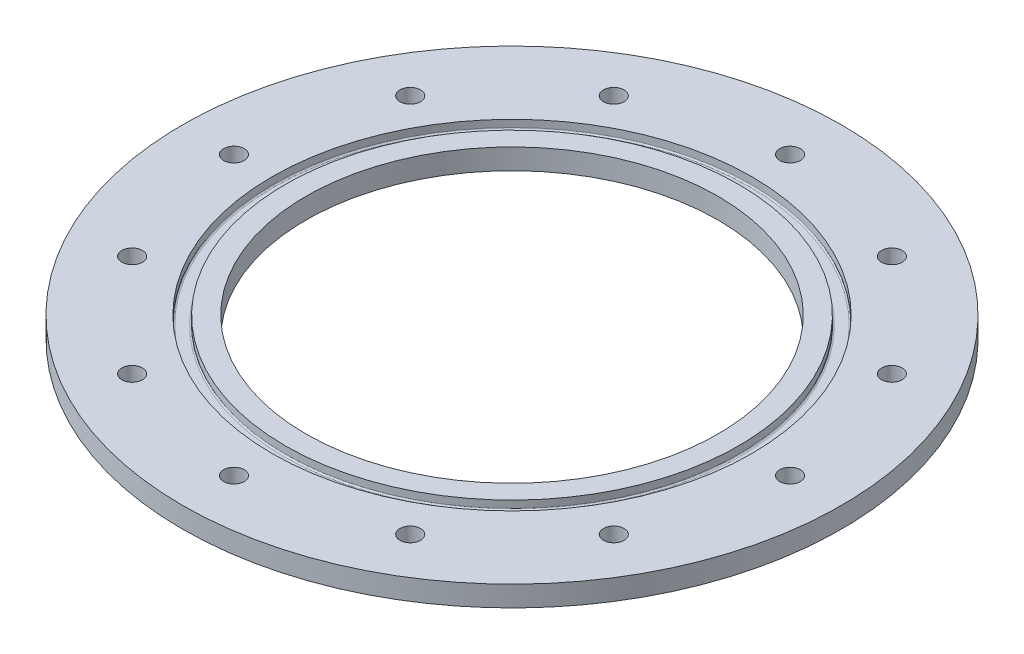
ISO-10303-21;
HEADER;
FILE_DESCRIPTION(('STEP AP214'),'2;1');
FILE_NAME('part.step','',(''),(''),'','','');
FILE_SCHEMA(('AUTOMOTIVE_DESIGN { 1 0 10303 214 1 1 1 1 }'));
ENDSEC;
DATA;
#1=APPLICATION_CONTEXT('core data for automotive mechanical design processes');
#2=APPLICATION_PROTOCOL_DEFINITION('international standard','automotive_design',2000,#1);
#3=PRODUCT_CONTEXT('',#1,'mechanical');
#4=PRODUCT('Part','Part','',(#3));
#5=PRODUCT_RELATED_PRODUCT_CATEGORY('part','',(#4));
#6=PRODUCT_DEFINITION_FORMATION('','',#4);
#7=PRODUCT_DEFINITION_CONTEXT('part definition',#1,'design');
#8=PRODUCT_DEFINITION('design','',#6,#7);
#9=PRODUCT_DEFINITION_SHAPE('','',#8);
#10=(LENGTH_UNIT() NAMED_UNIT(*) SI_UNIT(.MILLI.,.METRE.));
#11=(NAMED_UNIT(*) PLANE_ANGLE_UNIT() SI_UNIT($,.RADIAN.));
#12=(NAMED_UNIT(*) SI_UNIT($,.STERADIAN.) SOLID_ANGLE_UNIT());
#13=UNCERTAINTY_MEASURE_WITH_UNIT(LENGTH_MEASURE(1.E-05),#10,'distance_accuracy_value','');
#14=(GEOMETRIC_REPRESENTATION_CONTEXT(3) GLOBAL_UNCERTAINTY_ASSIGNED_CONTEXT((#13)) GLOBAL_UNIT_ASSIGNED_CONTEXT((#10,
#11,#12)) REPRESENTATION_CONTEXT('',''));
#15=CARTESIAN_POINT('',(0.,0.,0.));
#16=DIRECTION('',(0.,0.,1.));
#17=DIRECTION('',(1.,0.,0.));
#18=AXIS2_PLACEMENT_3D('',#15,#16,#17);
#19=CARTESIAN_POINT('',(0.,6.35000000000002,0.));
#20=DIRECTION('',(0.,1.,0.));
#21=DIRECTION('',(0.,0.,1.));
#22=AXIS2_PLACEMENT_3D('',#19,#20,#21);
#23=PLANE('',#22);
#24=CARTESIAN_POINT('',(0.,6.35000000000002,0.));
#25=DIRECTION('',(0.,1.,0.));
#26=DIRECTION('',(0.,0.,1.));
#27=AXIS2_PLACEMENT_3D('',#24,#25,#26);
#28=CIRCLE('',#27,63.5);
#29=CARTESIAN_POINT('',(0.,6.35000000000002,63.5));
#30=VERTEX_POINT('',#29);
#31=EDGE_CURVE('E84',#30,#30,#28,.T.);
#32=ORIENTED_EDGE('',*,*,#31,.F.);
#33=EDGE_LOOP('',(#32));
#34=FACE_BOUND('',#33,.T.);
#35=CARTESIAN_POINT('',(0.,6.35000000000002,0.));
#36=DIRECTION('',(0.,1.,0.));
#37=DIRECTION('',(0.,0.,1.));
#38=AXIS2_PLACEMENT_3D('',#35,#36,#37);
#39=CIRCLE('',#38,69.85);
#40=CARTESIAN_POINT('',(0.,6.35000000000002,69.85));
#41=VERTEX_POINT('',#40);
#42=EDGE_CURVE('E191',#41,#41,#39,.T.);
#43=ORIENTED_EDGE('',*,*,#42,.T.);
#44=EDGE_LOOP('',(#43));
#45=FACE_BOUND('',#44,.T.);
#46=ADVANCED_FACE('F51',(#34,#45),#23,.T.);
#47=CARTESIAN_POINT('',(0.,6.35000000000002,0.));
#48=DIRECTION('',(0.,-1.,0.));
#49=DIRECTION('',(0.,0.,-1.));
#50=AXIS2_PLACEMENT_3D('',#47,#48,#49);
#51=CYLINDRICAL_SURFACE('',#50,101.6);
#52=CARTESIAN_POINT('',(0.,6.35000000000002,0.));
#53=DIRECTION('',(0.,1.,0.));
#54=DIRECTION('',(0.,0.,1.));
#55=AXIS2_PLACEMENT_3D('',#52,#53,#54);
#56=CIRCLE('',#55,101.6);
#57=CARTESIAN_POINT('',(0.,6.35000000000002,101.6));
#58=VERTEX_POINT('',#57);
#59=EDGE_CURVE('E75',#58,#58,#56,.T.);
#60=ORIENTED_EDGE('',*,*,#59,.F.);
#61=EDGE_LOOP('',(#60));
#62=FACE_BOUND('',#61,.T.);
#63=CARTESIAN_POINT('',(0.,0.,0.));
#64=DIRECTION('',(0.,1.,0.));
#65=DIRECTION('',(0.,0.,1.));
#66=AXIS2_PLACEMENT_3D('',#63,#64,#65);
#67=CIRCLE('',#66,101.6);
#68=CARTESIAN_POINT('',(0.,0.,101.6));
#69=VERTEX_POINT('',#68);
#70=EDGE_CURVE('E76',#69,#69,#67,.T.);
#71=ORIENTED_EDGE('',*,*,#70,.T.);
#72=EDGE_LOOP('',(#71));
#73=FACE_BOUND('',#72,.T.);
#74=ADVANCED_FACE('F211',(#62,#73),#51,.T.);
#75=CARTESIAN_POINT('',(0.,6.35000000000002,0.));
#76=DIRECTION('',(0.,1.,0.));
#77=DIRECTION('',(0.,0.,1.));
#78=AXIS2_PLACEMENT_3D('',#75,#76,#77);
#79=CIRCLE('',#78,73.9394);
#80=CARTESIAN_POINT('',(0.,6.35000000000002,73.9394));
#81=VERTEX_POINT('',#80);
#82=EDGE_CURVE('E173',#81,#81,#79,.T.);
#83=ORIENTED_EDGE('',*,*,#82,.F.);
#84=EDGE_LOOP('',(#83));
#85=FACE_BOUND('',#84,.T.);
#86=CARTESIAN_POINT('',(-42.8624999999995,6.35000000000002,-74.2400277394192));
#87=DIRECTION('',(0.,1.,0.));
#88=DIRECTION('',(0.,0.,1.));
#89=AXIS2_PLACEMENT_3D('',#86,#87,#88);
#90=CIRCLE('',#89,3.1750000000021);
#91=CARTESIAN_POINT('',(-42.8624999999995,6.35000000000002,-71.0650277394171));
#92=VERTEX_POINT('',#91);
#93=EDGE_CURVE('E99',#92,#92,#90,.T.);
#94=ORIENTED_EDGE('',*,*,#93,.F.);
#95=EDGE_LOOP('',(#94));
#96=FACE_BOUND('',#95,.T.);
#97=CARTESIAN_POINT('',(42.8625,6.35000000000002,-74.240027739421));
#98=DIRECTION('',(0.,1.,0.));
#99=DIRECTION('',(0.,0.,1.));
#100=AXIS2_PLACEMENT_3D('',#97,#98,#99);
#101=CIRCLE('',#100,3.175);
#102=CARTESIAN_POINT('',(42.8625,6.35000000000002,-71.065027739421));
#103=VERTEX_POINT('',#102);
#104=EDGE_CURVE('E150',#103,#103,#101,.T.);
#105=ORIENTED_EDGE('',*,*,#104,.F.);
#106=EDGE_LOOP('',(#105));
#107=FACE_BOUND('',#106,.T.);
#108=CARTESIAN_POINT('',(74.2400277394228,6.35000000000002,-42.8625000000032));
#109=DIRECTION('',(0.,1.,0.));
#110=DIRECTION('',(0.,0.,1.));
#111=AXIS2_PLACEMENT_3D('',#108,#109,#110);
#112=CIRCLE('',#111,3.17500000000101);
#113=CARTESIAN_POINT('',(74.2400277394228,6.35000000000002,-39.6875000000022));
#114=VERTEX_POINT('',#113);
#115=EDGE_CURVE('E142',#114,#114,#112,.T.);
#116=ORIENTED_EDGE('',*,*,#115,.F.);
#117=EDGE_LOOP('',(#116));
#118=FACE_BOUND('',#117,.T.);
#119=CARTESIAN_POINT('',(85.7250000000036,6.35000000000002,-3.63598040564739E-12));
#120=DIRECTION('',(0.,1.,0.));
#121=DIRECTION('',(0.,0.,1.));
#122=AXIS2_PLACEMENT_3D('',#119,#120,#121);
#123=CIRCLE('',#122,3.1750000000027);
#124=CARTESIAN_POINT('',(85.7250000000036,6.35000000000002,3.17499999999907));
#125=VERTEX_POINT('',#124);
#126=EDGE_CURVE('E134',#125,#125,#123,.T.);
#127=ORIENTED_EDGE('',*,*,#126,.F.);
#128=EDGE_LOOP('',(#127));
#129=FACE_BOUND('',#128,.T.);
#130=CARTESIAN_POINT('',(74.2400277394264,6.35000000000002,42.8624999999968));
#131=DIRECTION('',(0.,1.,0.));
#132=DIRECTION('',(0.,0.,1.));
#133=AXIS2_PLACEMENT_3D('',#130,#131,#132);
#134=CIRCLE('',#133,3.17500000000469);
#135=CARTESIAN_POINT('',(74.2400277394264,6.35000000000002,46.0375000000015));
#136=VERTEX_POINT('',#135);
#137=EDGE_CURVE('E126',#136,#136,#134,.T.);
#138=ORIENTED_EDGE('',*,*,#137,.F.);
#139=EDGE_LOOP('',(#138));
#140=FACE_BOUND('',#139,.T.);
#141=CARTESIAN_POINT('',(42.8625000000068,6.35000000000002,74.2400277394192));
#142=DIRECTION('',(0.,1.,0.));
#143=DIRECTION('',(0.,0.,1.));
#144=AXIS2_PLACEMENT_3D('',#141,#142,#143);
#145=CIRCLE('',#144,3.17500000000647);
#146=CARTESIAN_POINT('',(42.8625000000068,6.35000000000002,77.4150277394257));
#147=VERTEX_POINT('',#146);
#148=EDGE_CURVE('E118',#147,#147,#145,.T.);
#149=ORIENTED_EDGE('',*,*,#148,.F.);
#150=EDGE_LOOP('',(#149));
#151=FACE_BOUND('',#150,.T.);
#152=CARTESIAN_POINT('',(7.27543025824673E-12,6.35000000000002,85.725));
#153=DIRECTION('',(0.,1.,0.));
#154=DIRECTION('',(0.,0.,1.));
#155=AXIS2_PLACEMENT_3D('',#152,#153,#154);
#156=CIRCLE('',#155,3.17500000000754);
#157=CARTESIAN_POINT('',(7.27507776243641E-12,6.35000000000002,88.9000000000076));
#158=VERTEX_POINT('',#157);
#159=EDGE_CURVE('E110',#158,#158,#156,.T.);
#160=ORIENTED_EDGE('',*,*,#159,.F.);
#161=EDGE_LOOP('',(#160));
#162=FACE_BOUND('',#161,.T.);
#163=CARTESIAN_POINT('',(-42.8624999999932,6.35000000000002,74.2400277394229));
#164=DIRECTION('',(0.,1.,0.));
#165=DIRECTION('',(0.,0.,1.));
#166=AXIS2_PLACEMENT_3D('',#163,#164,#165);
#167=CIRCLE('',#166,3.17500000000773);
#168=CARTESIAN_POINT('',(-42.8624999999932,6.35000000000002,77.4150277394306));
#169=VERTEX_POINT('',#168);
#170=EDGE_CURVE('E100',#169,#169,#167,.T.);
#171=ORIENTED_EDGE('',*,*,#170,.F.);
#172=EDGE_LOOP('',(#171));
#173=FACE_BOUND('',#172,.T.);
#174=CARTESIAN_POINT('',(-74.2400277394155,6.35000000000002,42.8625000000032));
#175=DIRECTION('',(0.,1.,0.));
#176=DIRECTION('',(0.,0.,1.));
#177=AXIS2_PLACEMENT_3D('',#174,#175,#176);
#178=CIRCLE('',#177,3.17500000000694);
#179=CARTESIAN_POINT('',(-74.2400277394155,6.35000000000002,46.0375000000102));
#180=VERTEX_POINT('',#179);
#181=EDGE_CURVE('E109',#180,#180,#178,.T.);
#182=ORIENTED_EDGE('',*,*,#181,.F.);
#183=EDGE_LOOP('',(#182));
#184=FACE_BOUND('',#183,.T.);
#185=CARTESIAN_POINT('',(-85.7249999999963,6.35000000000002,3.66373598126302E-12));
#186=DIRECTION('',(0.,1.,0.));
#187=DIRECTION('',(0.,0.,1.));
#188=AXIS2_PLACEMENT_3D('',#185,#186,#187);
#189=CIRCLE('',#188,3.17500000000542);
#190=CARTESIAN_POINT('',(-85.7249999999963,6.35000000000002,3.17500000000909));
#191=VERTEX_POINT('',#190);
#192=EDGE_CURVE('E174',#191,#191,#189,.T.);
#193=ORIENTED_EDGE('',*,*,#192,.F.);
#194=EDGE_LOOP('',(#193));
#195=FACE_BOUND('',#194,.T.);
#196=CARTESIAN_POINT('',(0.,6.35000000000002,-85.725));
#197=DIRECTION('',(0.,1.,0.));
#198=DIRECTION('',(0.,0.,1.));
#199=AXIS2_PLACEMENT_3D('',#196,#197,#198);
#200=CIRCLE('',#199,3.175);
#201=CARTESIAN_POINT('',(0.,6.35000000000002,-82.55));
#202=VERTEX_POINT('',#201);
#203=EDGE_CURVE('E164',#202,#202,#200,.T.);
#204=ORIENTED_EDGE('',*,*,#203,.F.);
#205=EDGE_LOOP('',(#204));
#206=FACE_BOUND('',#205,.T.);
#207=CARTESIAN_POINT('',(-74.2400277394192,6.35000000000002,-42.8624999999968));
#208=DIRECTION('',(0.,1.,0.));
#209=DIRECTION('',(0.,0.,1.));
#210=AXIS2_PLACEMENT_3D('',#207,#208,#209);
#211=CIRCLE('',#210,3.17500000000368);
#212=CARTESIAN_POINT('',(-74.2400277394192,6.35000000000002,-39.6874999999931));
#213=VERTEX_POINT('',#212);
#214=EDGE_CURVE('E95',#213,#213,#211,.T.);
#215=ORIENTED_EDGE('',*,*,#214,.F.);
#216=EDGE_LOOP('',(#215));
#217=FACE_BOUND('',#216,.T.);
#218=ORIENTED_EDGE('',*,*,#59,.T.);
#219=EDGE_LOOP('',(#218));
#220=FACE_BOUND('',#219,.T.);
#221=ADVANCED_FACE('F214',(#85,#96,#107,#118,#129,#140,#151,#162,#173,#184,#195,#206,#217,#220),
#23,.T.);
#222=CARTESIAN_POINT('',(0.,0.,0.));
#223=DIRECTION('',(0.,1.,0.));
#224=DIRECTION('',(0.,0.,1.));
#225=AXIS2_PLACEMENT_3D('',#222,#223,#224);
#226=PLANE('',#225);
#227=CARTESIAN_POINT('',(-42.8624999999995,0.,-74.2400277394192));
#228=DIRECTION('',(0.,1.,0.));
#229=DIRECTION('',(0.,0.,1.));
#230=AXIS2_PLACEMENT_3D('',#227,#228,#229);
#231=CIRCLE('',#230,3.1750000000021);
#232=CARTESIAN_POINT('',(-42.8624999999995,0.,-71.0650277394171));
#233=VERTEX_POINT('',#232);
#234=EDGE_CURVE('E154',#233,#233,#231,.F.);
#235=ORIENTED_EDGE('',*,*,#234,.F.);
#236=EDGE_LOOP('',(#235));
#237=FACE_BOUND('',#236,.T.);
#238=CARTESIAN_POINT('',(42.8625,0.,-74.240027739421));
#239=DIRECTION('',(0.,1.,0.));
#240=DIRECTION('',(0.,0.,1.));
#241=AXIS2_PLACEMENT_3D('',#238,#239,#240);
#242=CIRCLE('',#241,3.175);
#243=CARTESIAN_POINT('',(42.8625,0.,-71.065027739421));
#244=VERTEX_POINT('',#243);
#245=EDGE_CURVE('E146',#244,#244,#242,.F.);
#246=ORIENTED_EDGE('',*,*,#245,.F.);
#247=EDGE_LOOP('',(#246));
#248=FACE_BOUND('',#247,.T.);
#249=CARTESIAN_POINT('',(74.2400277394228,0.,-42.8625000000032));
#250=DIRECTION('',(0.,1.,0.));
#251=DIRECTION('',(0.,0.,1.));
#252=AXIS2_PLACEMENT_3D('',#249,#250,#251);
#253=CIRCLE('',#252,3.17500000000101);
#254=CARTESIAN_POINT('',(74.2400277394228,0.,-39.6875000000022));
#255=VERTEX_POINT('',#254);
#256=EDGE_CURVE('E138',#255,#255,#253,.F.);
#257=ORIENTED_EDGE('',*,*,#256,.F.);
#258=EDGE_LOOP('',(#257));
#259=FACE_BOUND('',#258,.T.);
#260=CARTESIAN_POINT('',(85.7250000000036,0.,-3.63598040564739E-12));
#261=DIRECTION('',(0.,1.,0.));
#262=DIRECTION('',(0.,0.,1.));
#263=AXIS2_PLACEMENT_3D('',#260,#261,#262);
#264=CIRCLE('',#263,3.1750000000027);
#265=CARTESIAN_POINT('',(85.7250000000036,0.,3.17499999999907));
#266=VERTEX_POINT('',#265);
#267=EDGE_CURVE('E130',#266,#266,#264,.F.);
#268=ORIENTED_EDGE('',*,*,#267,.F.);
#269=EDGE_LOOP('',(#268));
#270=FACE_BOUND('',#269,.T.);
#271=CARTESIAN_POINT('',(74.2400277394264,0.,42.8624999999968));
#272=DIRECTION('',(0.,1.,0.));
#273=DIRECTION('',(0.,0.,1.));
#274=AXIS2_PLACEMENT_3D('',#271,#272,#273);
#275=CIRCLE('',#274,3.17500000000469);
#276=CARTESIAN_POINT('',(74.2400277394264,0.,46.0375000000015));
#277=VERTEX_POINT('',#276);
#278=EDGE_CURVE('E122',#277,#277,#275,.F.);
#279=ORIENTED_EDGE('',*,*,#278,.F.);
#280=EDGE_LOOP('',(#279));
#281=FACE_BOUND('',#280,.T.);
#282=CARTESIAN_POINT('',(42.8625000000068,0.,74.2400277394192));
#283=DIRECTION('',(0.,1.,0.));
#284=DIRECTION('',(0.,0.,1.));
#285=AXIS2_PLACEMENT_3D('',#282,#283,#284);
#286=CIRCLE('',#285,3.17500000000647);
#287=CARTESIAN_POINT('',(42.8625000000068,0.,77.4150277394257));
#288=VERTEX_POINT('',#287);
#289=EDGE_CURVE('E114',#288,#288,#286,.F.);
#290=ORIENTED_EDGE('',*,*,#289,.F.);
#291=EDGE_LOOP('',(#290));
#292=FACE_BOUND('',#291,.T.);
#293=CARTESIAN_POINT('',(7.27543025824673E-12,0.,85.725));
#294=DIRECTION('',(0.,1.,0.));
#295=DIRECTION('',(0.,0.,1.));
#296=AXIS2_PLACEMENT_3D('',#293,#294,#295);
#297=CIRCLE('',#296,3.17500000000754);
#298=CARTESIAN_POINT('',(7.27507776243641E-12,0.,88.9000000000076));
#299=VERTEX_POINT('',#298);
#300=EDGE_CURVE('E104',#299,#299,#297,.F.);
#301=ORIENTED_EDGE('',*,*,#300,.F.);
#302=EDGE_LOOP('',(#301));
#303=FACE_BOUND('',#302,.T.);
#304=CARTESIAN_POINT('',(-42.8624999999932,0.,74.2400277394229));
#305=DIRECTION('',(0.,1.,0.));
#306=DIRECTION('',(0.,0.,1.));
#307=AXIS2_PLACEMENT_3D('',#304,#305,#306);
#308=CIRCLE('',#307,3.17500000000773);
#309=CARTESIAN_POINT('',(-42.8624999999932,0.,77.4150277394306));
#310=VERTEX_POINT('',#309);
#311=EDGE_CURVE('E105',#310,#310,#308,.F.);
#312=ORIENTED_EDGE('',*,*,#311,.F.);
#313=EDGE_LOOP('',(#312));
#314=FACE_BOUND('',#313,.T.);
#315=CARTESIAN_POINT('',(-74.2400277394155,0.,42.8625000000032));
#316=DIRECTION('',(0.,1.,0.));
#317=DIRECTION('',(0.,0.,1.));
#318=AXIS2_PLACEMENT_3D('',#315,#316,#317);
#319=CIRCLE('',#318,3.17500000000694);
#320=CARTESIAN_POINT('',(-74.2400277394155,0.,46.0375000000102));
#321=VERTEX_POINT('',#320);
#322=EDGE_CURVE('E178',#321,#321,#319,.F.);
#323=ORIENTED_EDGE('',*,*,#322,.F.);
#324=EDGE_LOOP('',(#323));
#325=FACE_BOUND('',#324,.T.);
#326=CARTESIAN_POINT('',(-85.7249999999963,0.,3.66373598126302E-12));
#327=DIRECTION('',(0.,1.,0.));
#328=DIRECTION('',(0.,0.,1.));
#329=AXIS2_PLACEMENT_3D('',#326,#327,#328);
#330=CIRCLE('',#329,3.17500000000542);
#331=CARTESIAN_POINT('',(-85.7249999999963,0.,3.17500000000909));
#332=VERTEX_POINT('',#331);
#333=EDGE_CURVE('E168',#332,#332,#330,.F.);
#334=ORIENTED_EDGE('',*,*,#333,.F.);
#335=EDGE_LOOP('',(#334));
#336=FACE_BOUND('',#335,.T.);
#337=CARTESIAN_POINT('',(0.,0.,-85.725));
#338=DIRECTION('',(0.,1.,0.));
#339=DIRECTION('',(0.,0.,1.));
#340=AXIS2_PLACEMENT_3D('',#337,#338,#339);
#341=CIRCLE('',#340,3.175);
#342=CARTESIAN_POINT('',(0.,0.,-82.55));
#343=VERTEX_POINT('',#342);
#344=EDGE_CURVE('E169',#343,#343,#341,.F.);
#345=ORIENTED_EDGE('',*,*,#344,.F.);
#346=EDGE_LOOP('',(#345));
#347=FACE_BOUND('',#346,.T.);
#348=CARTESIAN_POINT('',(-74.2400277394192,0.,-42.8624999999968));
#349=DIRECTION('',(0.,1.,0.));
#350=DIRECTION('',(0.,0.,1.));
#351=AXIS2_PLACEMENT_3D('',#348,#349,#350);
#352=CIRCLE('',#351,3.17500000000368);
#353=CARTESIAN_POINT('',(-74.2400277394192,0.,-39.6874999999931));
#354=VERTEX_POINT('',#353);
#355=EDGE_CURVE('E88',#354,#354,#352,.F.);
#356=ORIENTED_EDGE('',*,*,#355,.F.);
#357=EDGE_LOOP('',(#356));
#358=FACE_BOUND('',#357,.T.);
#359=CARTESIAN_POINT('',(0.,0.,0.));
#360=DIRECTION('',(0.,1.,0.));
#361=DIRECTION('',(0.,0.,1.));
#362=AXIS2_PLACEMENT_3D('',#359,#360,#361);
#363=CIRCLE('',#362,63.5);
#364=CARTESIAN_POINT('',(0.,0.,63.5));
#365=VERTEX_POINT('',#364);
#366=EDGE_CURVE('E80',#365,#365,#363,.T.);
#367=ORIENTED_EDGE('',*,*,#366,.T.);
#368=EDGE_LOOP('',(#367));
#369=FACE_BOUND('',#368,.T.);
#370=ORIENTED_EDGE('',*,*,#70,.F.);
#371=EDGE_LOOP('',(#370));
#372=FACE_BOUND('',#371,.T.);
#373=ADVANCED_FACE('F224',(#237,#248,#259,#270,#281,#292,#303,#314,#325,#336,#347,#358,#369,
#372),#226,.F.);
#374=CARTESIAN_POINT('',(0.,0.,0.));
#375=DIRECTION('',(0.,1.,0.));
#376=DIRECTION('',(0.,0.,1.));
#377=AXIS2_PLACEMENT_3D('',#374,#375,#376);
#378=CYLINDRICAL_SURFACE('',#377,63.5);
#379=ORIENTED_EDGE('',*,*,#366,.F.);
#380=EDGE_LOOP('',(#379));
#381=FACE_BOUND('',#380,.T.);
#382=ORIENTED_EDGE('',*,*,#31,.T.);
#383=EDGE_LOOP('',(#382));
#384=FACE_BOUND('',#383,.T.);
#385=ADVANCED_FACE('F229',(#381,#384),#378,.F.);
#386=CARTESIAN_POINT('',(-74.2400277394192,-0.000999999999973245,-42.8624999999968));
#387=DIRECTION('',(0.,1.,0.));
#388=DIRECTION('',(0.,0.,1.));
#389=AXIS2_PLACEMENT_3D('',#386,#387,#388);
#390=CYLINDRICAL_SURFACE('',#389,3.17500000000368);
#391=ORIENTED_EDGE('',*,*,#214,.T.);
#392=EDGE_LOOP('',(#391));
#393=FACE_BOUND('',#392,.T.);
#394=ORIENTED_EDGE('',*,*,#355,.T.);
#395=EDGE_LOOP('',(#394));
#396=FACE_BOUND('',#395,.T.);
#397=ADVANCED_FACE('F262',(#393,#396),#390,.F.);
#398=CARTESIAN_POINT('',(0.,-0.000999999999973245,-85.725));
#399=DIRECTION('',(0.,1.,0.));
#400=DIRECTION('',(0.,0.,1.));
#401=AXIS2_PLACEMENT_3D('',#398,#399,#400);
#402=CYLINDRICAL_SURFACE('',#401,3.175);
#403=ORIENTED_EDGE('',*,*,#203,.T.);
#404=EDGE_LOOP('',(#403));
#405=FACE_BOUND('',#404,.T.);
#406=ORIENTED_EDGE('',*,*,#344,.T.);
#407=EDGE_LOOP('',(#406));
#408=FACE_BOUND('',#407,.T.);
#409=ADVANCED_FACE('F265',(#405,#408),#402,.F.);
#410=CARTESIAN_POINT('',(-85.7249999999963,-0.000999999999973245,3.66373598126302E-12));
#411=DIRECTION('',(0.,1.,0.));
#412=DIRECTION('',(0.,0.,1.));
#413=AXIS2_PLACEMENT_3D('',#410,#411,#412);
#414=CYLINDRICAL_SURFACE('',#413,3.17500000000542);
#415=ORIENTED_EDGE('',*,*,#192,.T.);
#416=EDGE_LOOP('',(#415));
#417=FACE_BOUND('',#416,.T.);
#418=ORIENTED_EDGE('',*,*,#333,.T.);
#419=EDGE_LOOP('',(#418));
#420=FACE_BOUND('',#419,.T.);
#421=ADVANCED_FACE('F312',(#417,#420),#414,.F.);
#422=CARTESIAN_POINT('',(-74.2400277394155,-0.000999999999973245,42.8625000000032));
#423=DIRECTION('',(0.,1.,0.));
#424=DIRECTION('',(0.,0.,1.));
#425=AXIS2_PLACEMENT_3D('',#422,#423,#424);
#426=CYLINDRICAL_SURFACE('',#425,3.17500000000694);
#427=ORIENTED_EDGE('',*,*,#181,.T.);
#428=EDGE_LOOP('',(#427));
#429=FACE_BOUND('',#428,.T.);
#430=ORIENTED_EDGE('',*,*,#322,.T.);
#431=EDGE_LOOP('',(#430));
#432=FACE_BOUND('',#431,.T.);
#433=ADVANCED_FACE('F281',(#429,#432),#426,.F.);
#434=CARTESIAN_POINT('',(-42.8624999999932,-0.000999999999973245,74.2400277394229));
#435=DIRECTION('',(0.,1.,0.));
#436=DIRECTION('',(0.,0.,1.));
#437=AXIS2_PLACEMENT_3D('',#434,#435,#436);
#438=CYLINDRICAL_SURFACE('',#437,3.17500000000773);
#439=ORIENTED_EDGE('',*,*,#170,.T.);
#440=EDGE_LOOP('',(#439));
#441=FACE_BOUND('',#440,.T.);
#442=ORIENTED_EDGE('',*,*,#311,.T.);
#443=EDGE_LOOP('',(#442));
#444=FACE_BOUND('',#443,.T.);
#445=ADVANCED_FACE('F277',(#441,#444),#438,.F.);
#446=CARTESIAN_POINT('',(7.27543025824673E-12,-0.000999999999973245,85.725));
#447=DIRECTION('',(0.,1.,0.));
#448=DIRECTION('',(0.,0.,1.));
#449=AXIS2_PLACEMENT_3D('',#446,#447,#448);
#450=CYLINDRICAL_SURFACE('',#449,3.17500000000754);
#451=ORIENTED_EDGE('',*,*,#159,.T.);
#452=EDGE_LOOP('',(#451));
#453=FACE_BOUND('',#452,.T.);
#454=ORIENTED_EDGE('',*,*,#300,.T.);
#455=EDGE_LOOP('',(#454));
#456=FACE_BOUND('',#455,.T.);
#457=ADVANCED_FACE('F280',(#453,#456),#450,.F.);
#458=CARTESIAN_POINT('',(42.8625000000068,-0.000999999999973245,74.2400277394192));
#459=DIRECTION('',(0.,1.,0.));
#460=DIRECTION('',(0.,0.,1.));
#461=AXIS2_PLACEMENT_3D('',#458,#459,#460);
#462=CYLINDRICAL_SURFACE('',#461,3.17500000000647);
#463=ORIENTED_EDGE('',*,*,#148,.T.);
#464=EDGE_LOOP('',(#463));
#465=FACE_BOUND('',#464,.T.);
#466=ORIENTED_EDGE('',*,*,#289,.T.);
#467=EDGE_LOOP('',(#466));
#468=FACE_BOUND('',#467,.T.);
#469=ADVANCED_FACE('F285',(#465,#468),#462,.F.);
#470=CARTESIAN_POINT('',(74.2400277394264,-0.000999999999973245,42.8624999999968));
#471=DIRECTION('',(0.,1.,0.));
#472=DIRECTION('',(0.,0.,1.));
#473=AXIS2_PLACEMENT_3D('',#470,#471,#472);
#474=CYLINDRICAL_SURFACE('',#473,3.17500000000469);
#475=ORIENTED_EDGE('',*,*,#137,.T.);
#476=EDGE_LOOP('',(#475));
#477=FACE_BOUND('',#476,.T.);
#478=ORIENTED_EDGE('',*,*,#278,.T.);
#479=EDGE_LOOP('',(#478));
#480=FACE_BOUND('',#479,.T.);
#481=ADVANCED_FACE('F289',(#477,#480),#474,.F.);
#482=CARTESIAN_POINT('',(85.7250000000036,-0.000999999999973245,-3.63598040564739E-12));
#483=DIRECTION('',(0.,1.,0.));
#484=DIRECTION('',(0.,0.,1.));
#485=AXIS2_PLACEMENT_3D('',#482,#483,#484);
#486=CYLINDRICAL_SURFACE('',#485,3.1750000000027);
#487=ORIENTED_EDGE('',*,*,#126,.T.);
#488=EDGE_LOOP('',(#487));
#489=FACE_BOUND('',#488,.T.);
#490=ORIENTED_EDGE('',*,*,#267,.T.);
#491=EDGE_LOOP('',(#490));
#492=FACE_BOUND('',#491,.T.);
#493=ADVANCED_FACE('F293',(#489,#492),#486,.F.);
#494=CARTESIAN_POINT('',(74.2400277394228,-0.000999999999973245,-42.8625000000032));
#495=DIRECTION('',(0.,1.,0.));
#496=DIRECTION('',(0.,0.,1.));
#497=AXIS2_PLACEMENT_3D('',#494,#495,#496);
#498=CYLINDRICAL_SURFACE('',#497,3.17500000000101);
#499=ORIENTED_EDGE('',*,*,#115,.T.);
#500=EDGE_LOOP('',(#499));
#501=FACE_BOUND('',#500,.T.);
#502=ORIENTED_EDGE('',*,*,#256,.T.);
#503=EDGE_LOOP('',(#502));
#504=FACE_BOUND('',#503,.T.);
#505=ADVANCED_FACE('F297',(#501,#504),#498,.F.);
#506=CARTESIAN_POINT('',(42.8625,-0.000999999999973245,-74.240027739421));
#507=DIRECTION('',(0.,1.,0.));
#508=DIRECTION('',(0.,0.,1.));
#509=AXIS2_PLACEMENT_3D('',#506,#507,#508);
#510=CYLINDRICAL_SURFACE('',#509,3.175);
#511=ORIENTED_EDGE('',*,*,#104,.T.);
#512=EDGE_LOOP('',(#511));
#513=FACE_BOUND('',#512,.T.);
#514=ORIENTED_EDGE('',*,*,#245,.T.);
#515=EDGE_LOOP('',(#514));
#516=FACE_BOUND('',#515,.T.);
#517=ADVANCED_FACE('F301',(#513,#516),#510,.F.);
#518=CARTESIAN_POINT('',(-42.8624999999995,-0.000999999999973245,-74.2400277394192));
#519=DIRECTION('',(0.,1.,0.));
#520=DIRECTION('',(0.,0.,1.));
#521=AXIS2_PLACEMENT_3D('',#518,#519,#520);
#522=CYLINDRICAL_SURFACE('',#521,3.1750000000021);
#523=ORIENTED_EDGE('',*,*,#93,.T.);
#524=EDGE_LOOP('',(#523));
#525=FACE_BOUND('',#524,.T.);
#526=ORIENTED_EDGE('',*,*,#234,.T.);
#527=EDGE_LOOP('',(#526));
#528=FACE_BOUND('',#527,.T.);
#529=ADVANCED_FACE('F305',(#525,#528),#522,.F.);
#530=CARTESIAN_POINT('',(0.,3.7084,0.));
#531=DIRECTION('',(0.,1.,0.));
#532=DIRECTION('',(0.,0.,1.));
#533=AXIS2_PLACEMENT_3D('',#530,#531,#532);
#534=CYLINDRICAL_SURFACE('',#533,73.9394);
#535=CARTESIAN_POINT('',(0.,4.14019999999998,0.));
#536=DIRECTION('',(0.,1.,0.));
#537=DIRECTION('',(0.,0.,1.));
#538=AXIS2_PLACEMENT_3D('',#535,#536,#537);
#539=CIRCLE('',#538,73.9394);
#540=CARTESIAN_POINT('',(0.,4.14019999999998,73.9394));
#541=VERTEX_POINT('',#540);
#542=EDGE_CURVE('E59',#541,#541,#539,.F.);
#543=ORIENTED_EDGE('',*,*,#542,.T.);
#544=EDGE_LOOP('',(#543));
#545=FACE_BOUND('',#544,.T.);
#546=ORIENTED_EDGE('',*,*,#82,.T.);
#547=EDGE_LOOP('',(#546));
#548=FACE_BOUND('',#547,.T.);
#549=ADVANCED_FACE('F207',(#545,#548),#534,.F.);
#550=CARTESIAN_POINT('',(0.,3.7084,0.));
#551=DIRECTION('',(0.,1.,0.));
#552=DIRECTION('',(0.,0.,1.));
#553=AXIS2_PLACEMENT_3D('',#550,#551,#552);
#554=PLANE('',#553);
#555=CARTESIAN_POINT('',(0.,3.7084,0.));
#556=DIRECTION('',(0.,1.,0.));
#557=DIRECTION('',(0.,0.,1.));
#558=AXIS2_PLACEMENT_3D('',#555,#556,#557);
#559=CIRCLE('',#558,73.5076);
#560=CARTESIAN_POINT('',(0.,3.7084,73.5076));
#561=VERTEX_POINT('',#560);
#562=EDGE_CURVE('E64',#561,#561,#559,.T.);
#563=ORIENTED_EDGE('',*,*,#562,.T.);
#564=EDGE_LOOP('',(#563));
#565=FACE_BOUND('',#564,.T.);
#566=CARTESIAN_POINT('',(0.,3.7084,0.));
#567=DIRECTION('',(0.,1.,0.));
#568=DIRECTION('',(0.,0.,1.));
#569=AXIS2_PLACEMENT_3D('',#566,#567,#568);
#570=CIRCLE('',#569,70.2818);
#571=CARTESIAN_POINT('',(0.,3.7084,70.2818));
#572=VERTEX_POINT('',#571);
#573=EDGE_CURVE('E69',#572,#572,#570,.F.);
#574=ORIENTED_EDGE('',*,*,#573,.T.);
#575=EDGE_LOOP('',(#574));
#576=FACE_BOUND('',#575,.T.);
#577=ADVANCED_FACE('F200',(#565,#576),#554,.T.);
#578=CARTESIAN_POINT('',(0.,3.7084,0.));
#579=DIRECTION('',(0.,1.,0.));
#580=DIRECTION('',(0.,0.,1.));
#581=AXIS2_PLACEMENT_3D('',#578,#579,#580);
#582=CYLINDRICAL_SURFACE('',#581,69.85);
#583=CARTESIAN_POINT('',(0.,4.14019999999998,0.));
#584=DIRECTION('',(0.,1.,0.));
#585=DIRECTION('',(0.,0.,1.));
#586=AXIS2_PLACEMENT_3D('',#583,#584,#585);
#587=CIRCLE('',#586,69.85);
#588=CARTESIAN_POINT('',(0.,4.14019999999998,69.85));
#589=VERTEX_POINT('',#588);
#590=EDGE_CURVE('E12',#589,#589,#587,.T.);
#591=ORIENTED_EDGE('',*,*,#590,.T.);
#592=EDGE_LOOP('',(#591));
#593=FACE_BOUND('',#592,.T.);
#594=ORIENTED_EDGE('',*,*,#42,.F.);
#595=EDGE_LOOP('',(#594));
#596=FACE_BOUND('',#595,.T.);
#597=ADVANCED_FACE('F197',(#593,#596),#582,.T.);
#598=CARTESIAN_POINT('',(0.,4.14019999999998,0.));
#599=DIRECTION('',(0.,1.,0.));
#600=DIRECTION('',(0.,0.,1.));
#601=AXIS2_PLACEMENT_3D('',#598,#599,#600);
#602=TOROIDAL_SURFACE('',#601,73.5076,0.4318);
#603=ORIENTED_EDGE('',*,*,#542,.F.);
#604=EDGE_LOOP('',(#603));
#605=FACE_BOUND('',#604,.T.);
#606=ORIENTED_EDGE('',*,*,#562,.F.);
#607=EDGE_LOOP('',(#606));
#608=FACE_BOUND('',#607,.T.);
#609=ADVANCED_FACE('F199',(#605,#608),#602,.F.);
#610=CARTESIAN_POINT('',(0.,4.14019999999998,0.));
#611=DIRECTION('',(0.,1.,0.));
#612=DIRECTION('',(0.,0.,1.));
#613=AXIS2_PLACEMENT_3D('',#610,#611,#612);
#614=TOROIDAL_SURFACE('',#613,70.2818,0.4318);
#615=ORIENTED_EDGE('',*,*,#573,.F.);
#616=EDGE_LOOP('',(#615));
#617=FACE_BOUND('',#616,.T.);
#618=ORIENTED_EDGE('',*,*,#590,.F.);
#619=EDGE_LOOP('',(#618));
#620=FACE_BOUND('',#619,.T.);
#621=ADVANCED_FACE('F53',(#617,#620),#614,.F.);
#622=CLOSED_SHELL('',(#46,#74,#221,#373,#385,#397,#409,#421,#433,#445,#457,#469,#481,#493,#505,
#517,#529,#549,#577,#597,#609,#621));
#623=MANIFOLD_SOLID_BREP('B2',#622);
#624=ADVANCED_BREP_SHAPE_REPRESENTATION('',(#18,#623),#14);
#625=SHAPE_DEFINITION_REPRESENTATION(#9,#624);
ENDSEC;
END-ISO-10303-21;
